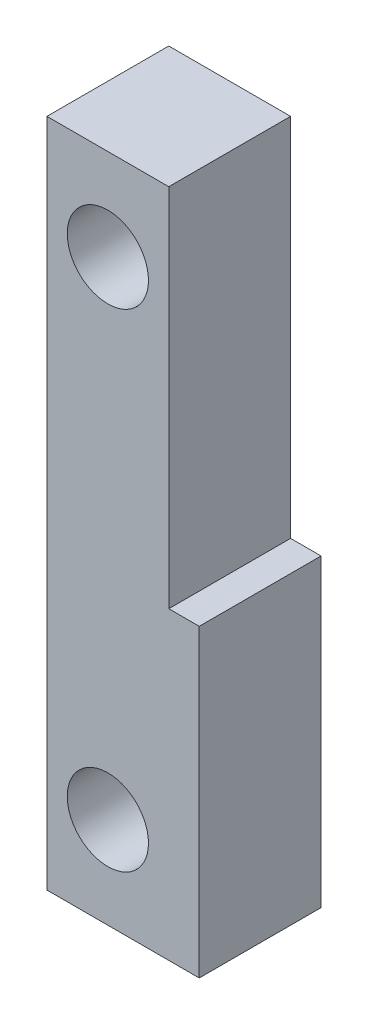
ISO-10303-21;
HEADER;
FILE_DESCRIPTION(('STEP AP214'),'2;1');
FILE_NAME('part.step','',(''),(''),'','','');
FILE_SCHEMA(('AUTOMOTIVE_DESIGN { 1 0 10303 214 1 1 1 1 }'));
ENDSEC;
DATA;
#1=APPLICATION_CONTEXT('core data for automotive mechanical design processes');
#2=APPLICATION_PROTOCOL_DEFINITION('international standard','automotive_design',2000,#1);
#3=PRODUCT_CONTEXT('',#1,'mechanical');
#4=PRODUCT('Part','Part','',(#3));
#5=PRODUCT_RELATED_PRODUCT_CATEGORY('part','',(#4));
#6=PRODUCT_DEFINITION_FORMATION('','',#4);
#7=PRODUCT_DEFINITION_CONTEXT('part definition',#1,'design');
#8=PRODUCT_DEFINITION('design','',#6,#7);
#9=PRODUCT_DEFINITION_SHAPE('','',#8);
#10=(LENGTH_UNIT() NAMED_UNIT(*) SI_UNIT(.MILLI.,.METRE.));
#11=(NAMED_UNIT(*) PLANE_ANGLE_UNIT() SI_UNIT($,.RADIAN.));
#12=(NAMED_UNIT(*) SI_UNIT($,.STERADIAN.) SOLID_ANGLE_UNIT());
#13=UNCERTAINTY_MEASURE_WITH_UNIT(LENGTH_MEASURE(1.E-05),#10,'distance_accuracy_value','');
#14=(GEOMETRIC_REPRESENTATION_CONTEXT(3) GLOBAL_UNCERTAINTY_ASSIGNED_CONTEXT((#13)) GLOBAL_UNIT_ASSIGNED_CONTEXT((#10,
#11,#12)) REPRESENTATION_CONTEXT('',''));
#15=CARTESIAN_POINT('',(0.,0.,0.));
#16=DIRECTION('',(0.,0.,1.));
#17=DIRECTION('',(1.,0.,0.));
#18=AXIS2_PLACEMENT_3D('',#15,#16,#17);
#19=CARTESIAN_POINT('',(3.,33.,-3.));
#20=DIRECTION('',(-1.,0.,0.));
#21=DIRECTION('',(0.,0.,1.));
#22=AXIS2_PLACEMENT_3D('',#19,#20,#21);
#23=PLANE('',#22);
#24=DIRECTION('',(0.,0.,1.));
#25=VECTOR('',#24,1.);
#26=CARTESIAN_POINT('',(3.,15.,3.));
#27=LINE('',#26,#25);
#28=CARTESIAN_POINT('',(3.,15.,-3.));
#29=VERTEX_POINT('',#28);
#30=CARTESIAN_POINT('',(3.,15.,3.));
#31=VERTEX_POINT('',#30);
#32=EDGE_CURVE('E48',#29,#31,#27,.T.);
#33=ORIENTED_EDGE('',*,*,#32,.F.);
#34=DIRECTION('',(0.,-1.,0.));
#35=VECTOR('',#34,1.);
#36=CARTESIAN_POINT('',(3.,33.,-3.));
#37=LINE('',#36,#35);
#38=CARTESIAN_POINT('',(3.,33.,-3.));
#39=VERTEX_POINT('',#38);
#40=EDGE_CURVE('E11',#39,#29,#37,.T.);
#41=ORIENTED_EDGE('',*,*,#40,.F.);
#42=DIRECTION('',(0.,0.,-1.));
#43=VECTOR('',#42,1.);
#44=CARTESIAN_POINT('',(3.,33.,-3.));
#45=LINE('',#44,#43);
#46=CARTESIAN_POINT('',(3.,33.,3.));
#47=VERTEX_POINT('',#46);
#48=EDGE_CURVE('E104',#47,#39,#45,.T.);
#49=ORIENTED_EDGE('',*,*,#48,.F.);
#50=DIRECTION('',(0.,-1.,0.));
#51=VECTOR('',#50,1.);
#52=CARTESIAN_POINT('',(3.,33.,3.));
#53=LINE('',#52,#51);
#54=EDGE_CURVE('E145',#47,#31,#53,.T.);
#55=ORIENTED_EDGE('',*,*,#54,.T.);
#56=EDGE_LOOP('',(#33,#41,#49,#55));
#57=FACE_BOUND('',#56,.T.);
#58=ADVANCED_FACE('F34',(#57),#23,.F.);
#59=CARTESIAN_POINT('',(-3.,33.,-3.));
#60=DIRECTION('',(0.,0.,1.));
#61=DIRECTION('',(1.,0.,0.));
#62=AXIS2_PLACEMENT_3D('',#59,#60,#61);
#63=PLANE('',#62);
#64=CARTESIAN_POINT('',(0.,28.5,-3.));
#65=DIRECTION('',(0.,0.,1.));
#66=DIRECTION('',(1.,0.,0.));
#67=AXIS2_PLACEMENT_3D('',#64,#65,#66);
#68=CIRCLE('',#67,2.);
#69=CARTESIAN_POINT('',(2.,28.5,-3.));
#70=VERTEX_POINT('',#69);
#71=EDGE_CURVE('E137',#70,#70,#68,.T.);
#72=ORIENTED_EDGE('',*,*,#71,.T.);
#73=EDGE_LOOP('',(#72));
#74=FACE_BOUND('',#73,.T.);
#75=CARTESIAN_POINT('',(0.,4.5,-3.));
#76=DIRECTION('',(0.,0.,1.));
#77=DIRECTION('',(1.,0.,0.));
#78=AXIS2_PLACEMENT_3D('',#75,#76,#77);
#79=CIRCLE('',#78,2.);
#80=CARTESIAN_POINT('',(2.,4.5,-3.));
#81=VERTEX_POINT('',#80);
#82=EDGE_CURVE('E132',#81,#81,#79,.T.);
#83=ORIENTED_EDGE('',*,*,#82,.T.);
#84=EDGE_LOOP('',(#83));
#85=FACE_BOUND('',#84,.T.);
#86=DIRECTION('',(-1.,0.,0.));
#87=VECTOR('',#86,1.);
#88=CARTESIAN_POINT('',(-3.,0.,-3.));
#89=LINE('',#88,#87);
#90=CARTESIAN_POINT('',(4.5,0.,-3.));
#91=VERTEX_POINT('',#90);
#92=CARTESIAN_POINT('',(-3.,0.,-3.));
#93=VERTEX_POINT('',#92);
#94=EDGE_CURVE('E109',#91,#93,#89,.T.);
#95=ORIENTED_EDGE('',*,*,#94,.T.);
#96=DIRECTION('',(0.,-1.,0.));
#97=VECTOR('',#96,1.);
#98=CARTESIAN_POINT('',(-3.,33.,-3.));
#99=LINE('',#98,#97);
#100=CARTESIAN_POINT('',(-3.,33.,-3.));
#101=VERTEX_POINT('',#100);
#102=EDGE_CURVE('E41',#101,#93,#99,.T.);
#103=ORIENTED_EDGE('',*,*,#102,.F.);
#104=DIRECTION('',(-1.,0.,0.));
#105=VECTOR('',#104,1.);
#106=CARTESIAN_POINT('',(-3.,33.,-3.));
#107=LINE('',#106,#105);
#108=EDGE_CURVE('E79',#39,#101,#107,.T.);
#109=ORIENTED_EDGE('',*,*,#108,.F.);
#110=ORIENTED_EDGE('',*,*,#40,.T.);
#111=DIRECTION('',(-1.,0.,0.));
#112=VECTOR('',#111,1.);
#113=CARTESIAN_POINT('',(4.5,15.,-3.));
#114=LINE('',#113,#112);
#115=CARTESIAN_POINT('',(4.5,15.,-3.));
#116=VERTEX_POINT('',#115);
#117=EDGE_CURVE('E125',#116,#29,#114,.T.);
#118=ORIENTED_EDGE('',*,*,#117,.F.);
#119=DIRECTION('',(0.,1.,0.));
#120=VECTOR('',#119,1.);
#121=CARTESIAN_POINT('',(4.5,0.,-3.));
#122=LINE('',#121,#120);
#123=EDGE_CURVE('E112',#91,#116,#122,.T.);
#124=ORIENTED_EDGE('',*,*,#123,.F.);
#125=EDGE_LOOP('',(#95,#103,#109,#110,#118,#124));
#126=FACE_BOUND('',#125,.T.);
#127=ADVANCED_FACE('F151',(#74,#85,#126),#63,.F.);
#128=CARTESIAN_POINT('',(-3.,33.,-3.));
#129=DIRECTION('',(1.,0.,0.));
#130=DIRECTION('',(0.,0.,-1.));
#131=AXIS2_PLACEMENT_3D('',#128,#129,#130);
#132=PLANE('',#131);
#133=DIRECTION('',(0.,0.,1.));
#134=VECTOR('',#133,1.);
#135=CARTESIAN_POINT('',(-3.,0.,-3.));
#136=LINE('',#135,#134);
#137=CARTESIAN_POINT('',(-3.,0.,3.));
#138=VERTEX_POINT('',#137);
#139=EDGE_CURVE('E72',#93,#138,#136,.T.);
#140=ORIENTED_EDGE('',*,*,#139,.T.);
#141=DIRECTION('',(0.,-1.,0.));
#142=VECTOR('',#141,1.);
#143=CARTESIAN_POINT('',(-3.,33.,3.));
#144=LINE('',#143,#142);
#145=CARTESIAN_POINT('',(-3.,33.,3.));
#146=VERTEX_POINT('',#145);
#147=EDGE_CURVE('E102',#146,#138,#144,.T.);
#148=ORIENTED_EDGE('',*,*,#147,.F.);
#149=DIRECTION('',(0.,0.,1.));
#150=VECTOR('',#149,1.);
#151=CARTESIAN_POINT('',(-3.,33.,-3.));
#152=LINE('',#151,#150);
#153=EDGE_CURVE('E142',#101,#146,#152,.T.);
#154=ORIENTED_EDGE('',*,*,#153,.F.);
#155=ORIENTED_EDGE('',*,*,#102,.T.);
#156=EDGE_LOOP('',(#140,#148,#154,#155));
#157=FACE_BOUND('',#156,.T.);
#158=ADVANCED_FACE('F150',(#157),#132,.F.);
#159=CARTESIAN_POINT('',(-3.,33.,3.));
#160=DIRECTION('',(0.,0.,-1.));
#161=DIRECTION('',(-1.,0.,0.));
#162=AXIS2_PLACEMENT_3D('',#159,#160,#161);
#163=PLANE('',#162);
#164=CARTESIAN_POINT('',(0.,28.5,3.));
#165=DIRECTION('',(0.,0.,1.));
#166=DIRECTION('',(1.,0.,0.));
#167=AXIS2_PLACEMENT_3D('',#164,#165,#166);
#168=CIRCLE('',#167,2.);
#169=CARTESIAN_POINT('',(2.,28.5,3.));
#170=VERTEX_POINT('',#169);
#171=EDGE_CURVE('E129',#170,#170,#168,.T.);
#172=ORIENTED_EDGE('',*,*,#171,.F.);
#173=EDGE_LOOP('',(#172));
#174=FACE_BOUND('',#173,.T.);
#175=CARTESIAN_POINT('',(0.,4.5,3.));
#176=DIRECTION('',(0.,0.,1.));
#177=DIRECTION('',(1.,0.,0.));
#178=AXIS2_PLACEMENT_3D('',#175,#176,#177);
#179=CIRCLE('',#178,2.);
#180=CARTESIAN_POINT('',(2.,4.5,3.));
#181=VERTEX_POINT('',#180);
#182=EDGE_CURVE('E128',#181,#181,#179,.T.);
#183=ORIENTED_EDGE('',*,*,#182,.F.);
#184=EDGE_LOOP('',(#183));
#185=FACE_BOUND('',#184,.T.);
#186=DIRECTION('',(1.,0.,0.));
#187=VECTOR('',#186,1.);
#188=CARTESIAN_POINT('',(-3.,0.,3.));
#189=LINE('',#188,#187);
#190=CARTESIAN_POINT('',(4.5,0.,3.));
#191=VERTEX_POINT('',#190);
#192=EDGE_CURVE('E96',#138,#191,#189,.T.);
#193=ORIENTED_EDGE('',*,*,#192,.T.);
#194=DIRECTION('',(0.,-1.,0.));
#195=VECTOR('',#194,1.);
#196=CARTESIAN_POINT('',(4.5,0.,3.));
#197=LINE('',#196,#195);
#198=CARTESIAN_POINT('',(4.5,15.,3.));
#199=VERTEX_POINT('',#198);
#200=EDGE_CURVE('E101',#199,#191,#197,.T.);
#201=ORIENTED_EDGE('',*,*,#200,.F.);
#202=DIRECTION('',(-1.,0.,0.));
#203=VECTOR('',#202,1.);
#204=CARTESIAN_POINT('',(4.5,15.,3.));
#205=LINE('',#204,#203);
#206=EDGE_CURVE('E122',#199,#31,#205,.T.);
#207=ORIENTED_EDGE('',*,*,#206,.T.);
#208=ORIENTED_EDGE('',*,*,#54,.F.);
#209=DIRECTION('',(1.,0.,0.));
#210=VECTOR('',#209,1.);
#211=CARTESIAN_POINT('',(-3.,33.,3.));
#212=LINE('',#211,#210);
#213=EDGE_CURVE('E56',#146,#47,#212,.T.);
#214=ORIENTED_EDGE('',*,*,#213,.F.);
#215=ORIENTED_EDGE('',*,*,#147,.T.);
#216=EDGE_LOOP('',(#193,#201,#207,#208,#214,#215));
#217=FACE_BOUND('',#216,.T.);
#218=ADVANCED_FACE('F98',(#174,#185,#217),#163,.F.);
#219=CARTESIAN_POINT('',(0.,33.,0.));
#220=DIRECTION('',(0.,1.,0.));
#221=DIRECTION('',(0.,0.,1.));
#222=AXIS2_PLACEMENT_3D('',#219,#220,#221);
#223=PLANE('',#222);
#224=ORIENTED_EDGE('',*,*,#48,.T.);
#225=ORIENTED_EDGE('',*,*,#108,.T.);
#226=ORIENTED_EDGE('',*,*,#153,.T.);
#227=ORIENTED_EDGE('',*,*,#213,.T.);
#228=EDGE_LOOP('',(#224,#225,#226,#227));
#229=FACE_BOUND('',#228,.T.);
#230=ADVANCED_FACE('F156',(#229),#223,.T.);
#231=CARTESIAN_POINT('',(0.,0.,0.));
#232=DIRECTION('',(0.,1.,0.));
#233=DIRECTION('',(0.,0.,1.));
#234=AXIS2_PLACEMENT_3D('',#231,#232,#233);
#235=PLANE('',#234);
#236=ORIENTED_EDGE('',*,*,#94,.F.);
#237=DIRECTION('',(0.,0.,-1.));
#238=VECTOR('',#237,1.);
#239=CARTESIAN_POINT('',(4.5,0.,3.));
#240=LINE('',#239,#238);
#241=EDGE_CURVE('E107',#191,#91,#240,.T.);
#242=ORIENTED_EDGE('',*,*,#241,.F.);
#243=ORIENTED_EDGE('',*,*,#192,.F.);
#244=ORIENTED_EDGE('',*,*,#139,.F.);
#245=EDGE_LOOP('',(#236,#242,#243,#244));
#246=FACE_BOUND('',#245,.T.);
#247=ADVANCED_FACE('F108',(#246),#235,.F.);
#248=CARTESIAN_POINT('',(0.,4.5,-30.));
#249=DIRECTION('',(0.,0.,1.));
#250=DIRECTION('',(1.,0.,0.));
#251=AXIS2_PLACEMENT_3D('',#248,#249,#250);
#252=CYLINDRICAL_SURFACE('',#251,2.);
#253=ORIENTED_EDGE('',*,*,#182,.T.);
#254=EDGE_LOOP('',(#253));
#255=FACE_BOUND('',#254,.T.);
#256=ORIENTED_EDGE('',*,*,#82,.F.);
#257=EDGE_LOOP('',(#256));
#258=FACE_BOUND('',#257,.T.);
#259=ADVANCED_FACE('F163',(#255,#258),#252,.F.);
#260=CARTESIAN_POINT('',(0.,28.5,-30.));
#261=DIRECTION('',(0.,0.,1.));
#262=DIRECTION('',(1.,0.,0.));
#263=AXIS2_PLACEMENT_3D('',#260,#261,#262);
#264=CYLINDRICAL_SURFACE('',#263,2.);
#265=ORIENTED_EDGE('',*,*,#171,.T.);
#266=EDGE_LOOP('',(#265));
#267=FACE_BOUND('',#266,.T.);
#268=ORIENTED_EDGE('',*,*,#71,.F.);
#269=EDGE_LOOP('',(#268));
#270=FACE_BOUND('',#269,.T.);
#271=ADVANCED_FACE('F182',(#267,#270),#264,.F.);
#272=CARTESIAN_POINT('',(4.5,15.,3.));
#273=DIRECTION('',(0.,-1.,0.));
#274=DIRECTION('',(0.,0.,-1.));
#275=AXIS2_PLACEMENT_3D('',#272,#273,#274);
#276=PLANE('',#275);
#277=ORIENTED_EDGE('',*,*,#32,.T.);
#278=ORIENTED_EDGE('',*,*,#206,.F.);
#279=DIRECTION('',(0.,0.,1.));
#280=VECTOR('',#279,1.);
#281=CARTESIAN_POINT('',(4.5,15.,3.));
#282=LINE('',#281,#280);
#283=EDGE_CURVE('E116',#116,#199,#282,.T.);
#284=ORIENTED_EDGE('',*,*,#283,.F.);
#285=ORIENTED_EDGE('',*,*,#117,.T.);
#286=EDGE_LOOP('',(#277,#278,#284,#285));
#287=FACE_BOUND('',#286,.T.);
#288=ADVANCED_FACE('F154',(#287),#276,.F.);
#289=CARTESIAN_POINT('',(4.5,0.,0.));
#290=DIRECTION('',(-1.,0.,0.));
#291=DIRECTION('',(0.,0.,1.));
#292=AXIS2_PLACEMENT_3D('',#289,#290,#291);
#293=PLANE('',#292);
#294=ORIENTED_EDGE('',*,*,#200,.T.);
#295=ORIENTED_EDGE('',*,*,#241,.T.);
#296=ORIENTED_EDGE('',*,*,#123,.T.);
#297=ORIENTED_EDGE('',*,*,#283,.T.);
#298=EDGE_LOOP('',(#294,#295,#296,#297));
#299=FACE_BOUND('',#298,.T.);
#300=ADVANCED_FACE('F114',(#299),#293,.F.);
#301=CLOSED_SHELL('',(#58,#127,#158,#218,#230,#247,#259,#271,#288,#300));
#302=MANIFOLD_SOLID_BREP('B2',#301);
#303=ADVANCED_BREP_SHAPE_REPRESENTATION('',(#18,#302),#14);
#304=SHAPE_DEFINITION_REPRESENTATION(#9,#303);
ENDSEC;
END-ISO-10303-21;
